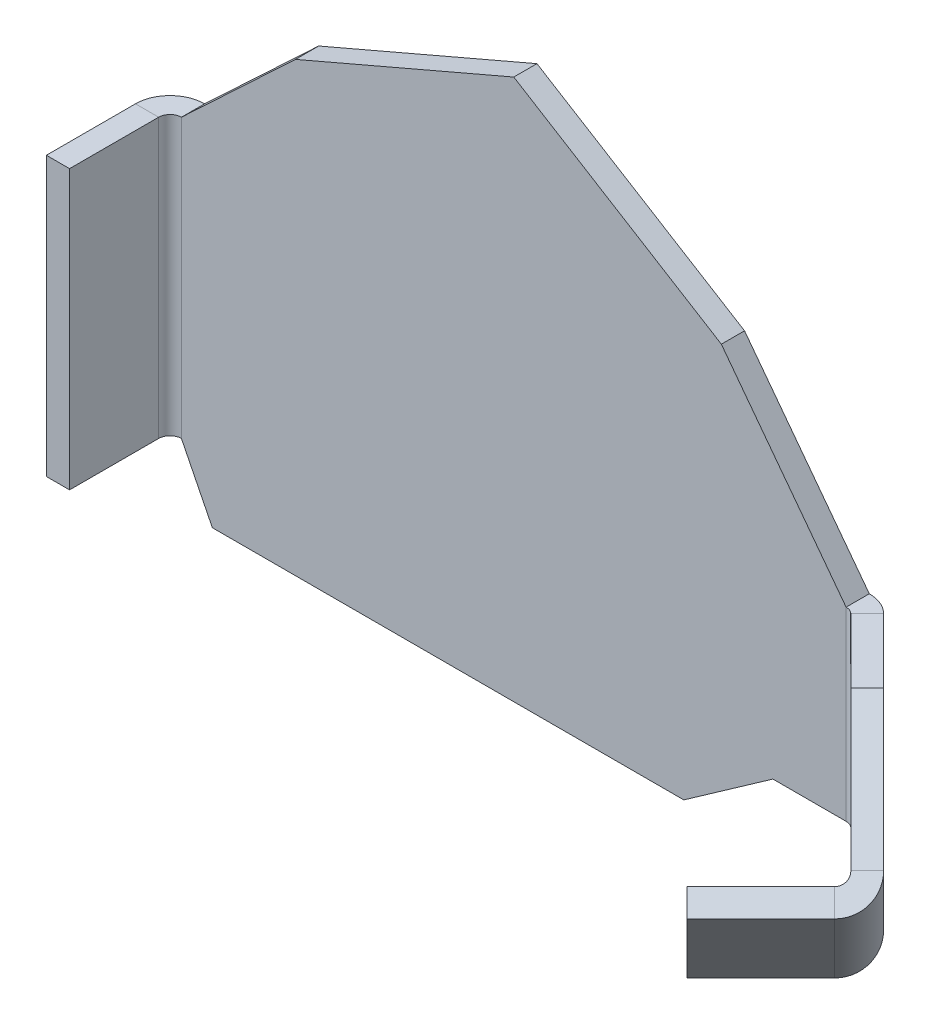
ISO-10303-21;
HEADER;
FILE_DESCRIPTION(('STEP AP214'),'2;1');
FILE_NAME('part.step','',(''),(''),'','','');
FILE_SCHEMA(('AUTOMOTIVE_DESIGN { 1 0 10303 214 1 1 1 1 }'));
ENDSEC;
DATA;
#1=APPLICATION_CONTEXT('core data for automotive mechanical design processes');
#2=APPLICATION_PROTOCOL_DEFINITION('international standard','automotive_design',2000,#1);
#3=PRODUCT_CONTEXT('',#1,'mechanical');
#4=PRODUCT('Part','Part','',(#3));
#5=PRODUCT_RELATED_PRODUCT_CATEGORY('part','',(#4));
#6=PRODUCT_DEFINITION_FORMATION('','',#4);
#7=PRODUCT_DEFINITION_CONTEXT('part definition',#1,'design');
#8=PRODUCT_DEFINITION('design','',#6,#7);
#9=PRODUCT_DEFINITION_SHAPE('','',#8);
#10=(LENGTH_UNIT() NAMED_UNIT(*) SI_UNIT(.MILLI.,.METRE.));
#11=(NAMED_UNIT(*) PLANE_ANGLE_UNIT() SI_UNIT($,.RADIAN.));
#12=(NAMED_UNIT(*) SI_UNIT($,.STERADIAN.) SOLID_ANGLE_UNIT());
#13=UNCERTAINTY_MEASURE_WITH_UNIT(LENGTH_MEASURE(1.E-05),#10,'distance_accuracy_value','');
#14=(GEOMETRIC_REPRESENTATION_CONTEXT(3) GLOBAL_UNCERTAINTY_ASSIGNED_CONTEXT((#13)) GLOBAL_UNIT_ASSIGNED_CONTEXT((#10,
#11,#12)) REPRESENTATION_CONTEXT('',''));
#15=CARTESIAN_POINT('',(0.,0.,0.));
#16=DIRECTION('',(0.,0.,1.));
#17=DIRECTION('',(1.,0.,0.));
#18=AXIS2_PLACEMENT_3D('',#15,#16,#17);
#19=CARTESIAN_POINT('',(12.1157698818237,0.,-11.8106601717798));
#20=DIRECTION('',(-0.707106781186544,0.,0.707106781186551));
#21=DIRECTION('',(0.707106781186551,0.,0.707106781186544));
#22=AXIS2_PLACEMENT_3D('',#19,#20,#21);
#23=PLANE('',#22);
#24=DIRECTION('',(0.500000000000003,-0.707106781186547,0.499999999999997));
#25=VECTOR('',#24,1.);
#26=CARTESIAN_POINT('',(23.6904280666929,16.3690385848747,-0.236001986910732));
#27=LINE('',#26,#25);
#28=CARTESIAN_POINT('',(32.5403910842826,3.85330085889911,8.61396103067887));
#29=VERTEX_POINT('',#28);
#30=CARTESIAN_POINT('',(36.7830317714019,-2.14669914110089,12.8566017177981));
#31=VERTEX_POINT('',#30);
#32=EDGE_CURVE('E117',#29,#31,#27,.T.);
#33=ORIENTED_EDGE('',*,*,#32,.T.);
#34=DIRECTION('',(-0.500000000000005,-0.707106781186544,-0.5));
#35=VECTOR('',#34,1.);
#36=CARTESIAN_POINT('',(25.2083735865326,-18.5157377259756,1.28194353292891));
#37=LINE('',#36,#35);
#38=CARTESIAN_POINT('',(28.7903910842825,-13.45,4.86396103067881));
#39=VERTEX_POINT('',#38);
#40=EDGE_CURVE('E337',#31,#39,#37,.T.);
#41=ORIENTED_EDGE('',*,*,#40,.T.);
#42=DIRECTION('',(-0.707106781186551,0.,-0.707106781186544));
#43=VECTOR('',#42,1.);
#44=CARTESIAN_POINT('',(12.1157698818237,-13.45,-11.8106601717798));
#45=LINE('',#44,#43);
#46=CARTESIAN_POINT('',(23.0815150268018,-13.45,-0.844915026801843));
#47=VERTEX_POINT('',#46);
#48=EDGE_CURVE('E345',#39,#47,#45,.T.);
#49=ORIENTED_EDGE('',*,*,#48,.T.);
#50=DIRECTION('',(0.,1.,0.));
#51=VECTOR('',#50,1.);
#52=CARTESIAN_POINT('',(23.0815150268018,-13.45,-0.844915026801843));
#53=LINE('',#52,#51);
#54=CARTESIAN_POINT('',(23.0815150268018,-1.45,-0.844915026801844));
#55=VERTEX_POINT('',#54);
#56=EDGE_CURVE('E356',#55,#47,#53,.F.);
#57=ORIENTED_EDGE('',*,*,#56,.F.);
#58=DIRECTION('',(0.707106781186551,0.,0.707106781186544));
#59=VECTOR('',#58,1.);
#60=CARTESIAN_POINT('',(12.1157698818237,-1.45,-11.8106601717798));
#61=LINE('',#60,#59);
#62=CARTESIAN_POINT('',(28.7903910842826,-1.45,4.8639610306789));
#63=VERTEX_POINT('',#62);
#64=EDGE_CURVE('E348',#55,#63,#61,.T.);
#65=ORIENTED_EDGE('',*,*,#64,.T.);
#66=DIRECTION('',(0.500000000000002,0.707106781186549,0.499999999999996));
#67=VECTOR('',#66,1.);
#68=CARTESIAN_POINT('',(28.7903910842826,-1.45,4.8639610306789));
#69=LINE('',#68,#67);
#70=EDGE_CURVE('E326',#63,#29,#69,.T.);
#71=ORIENTED_EDGE('',*,*,#70,.T.);
#72=EDGE_LOOP('',(#33,#41,#49,#57,#65,#71));
#73=FACE_BOUND('',#72,.T.);
#74=ADVANCED_FACE('F100',(#73),#23,.F.);
#75=CARTESIAN_POINT('',(11.0551097100439,0.,-10.75));
#76=DIRECTION('',(-0.707106781186544,0.,0.707106781186551));
#77=DIRECTION('',(0.707106781186551,0.,0.707106781186544));
#78=AXIS2_PLACEMENT_3D('',#75,#76,#77);
#79=PLANE('',#78);
#80=DIRECTION('',(-0.500000000000005,-0.707106781186544,-0.5));
#81=VECTOR('',#80,1.);
#82=CARTESIAN_POINT('',(24.1477134147528,-18.5157377259756,2.34260370470874));
#83=LINE('',#82,#81);
#84=CARTESIAN_POINT('',(35.7223715996221,-2.1466991411009,13.917261889578));
#85=VERTEX_POINT('',#84);
#86=CARTESIAN_POINT('',(27.7297309125027,-13.45,5.92462120245863));
#87=VERTEX_POINT('',#86);
#88=EDGE_CURVE('E334',#85,#87,#83,.T.);
#89=ORIENTED_EDGE('',*,*,#88,.F.);
#90=DIRECTION('',(0.500000000000003,-0.707106781186547,0.499999999999997));
#91=VECTOR('',#90,1.);
#92=CARTESIAN_POINT('',(22.6297678949131,16.3690385848747,0.824658184869095));
#93=LINE('',#92,#91);
#94=CARTESIAN_POINT('',(31.4797309125028,3.85330085889911,9.67462120245869));
#95=VERTEX_POINT('',#94);
#96=EDGE_CURVE('E319',#95,#85,#93,.T.);
#97=ORIENTED_EDGE('',*,*,#96,.F.);
#98=DIRECTION('',(0.500000000000002,0.707106781186549,0.499999999999997));
#99=VECTOR('',#98,1.);
#100=CARTESIAN_POINT('',(27.7297309125028,-1.45,5.92462120245872));
#101=LINE('',#100,#99);
#102=CARTESIAN_POINT('',(27.7297309125028,-1.45,5.92462120245873));
#103=VERTEX_POINT('',#102);
#104=EDGE_CURVE('E331',#103,#95,#101,.T.);
#105=ORIENTED_EDGE('',*,*,#104,.F.);
#106=DIRECTION('',(-0.707106781186551,0.,-0.707106781186544));
#107=VECTOR('',#106,1.);
#108=CARTESIAN_POINT('',(36.2150122867414,-1.45,14.4099025766972));
#109=LINE('',#108,#107);
#110=CARTESIAN_POINT('',(22.020854855022,-1.45,0.215745144977982));
#111=VERTEX_POINT('',#110);
#112=EDGE_CURVE('E353',#111,#103,#109,.F.);
#113=ORIENTED_EDGE('',*,*,#112,.F.);
#114=DIRECTION('',(0.,1.,0.));
#115=VECTOR('',#114,1.);
#116=CARTESIAN_POINT('',(22.020854855022,-13.45,0.215745144977983));
#117=LINE('',#116,#115);
#118=CARTESIAN_POINT('',(22.020854855022,-13.45,0.215745144977981));
#119=VERTEX_POINT('',#118);
#120=EDGE_CURVE('E362',#119,#111,#117,.T.);
#121=ORIENTED_EDGE('',*,*,#120,.F.);
#122=DIRECTION('',(0.707106781186551,0.,0.707106781186544));
#123=VECTOR('',#122,1.);
#124=CARTESIAN_POINT('',(21.805109710044,-13.45,0.));
#125=LINE('',#124,#123);
#126=EDGE_CURVE('E351',#87,#119,#125,.F.);
#127=ORIENTED_EDGE('',*,*,#126,.F.);
#128=EDGE_LOOP('',(#89,#97,#105,#113,#121,#127));
#129=FACE_BOUND('',#128,.T.);
#130=ADVANCED_FACE('F534',(#129),#79,.T.);
#131=CARTESIAN_POINT('',(17.8969405565523,-1.45,15.7574115584093));
#132=DIRECTION('',(-0.500000000000004,0.707106781186546,-0.499999999999998));
#133=DIRECTION('',(-0.816496580927724,-0.577350269189629,0.));
#134=AXIS2_PLACEMENT_3D('',#131,#132,#133);
#135=PLANE('',#134);
#136=ORIENTED_EDGE('',*,*,#104,.T.);
#137=DIRECTION('',(0.707106781186544,0.,-0.707106781186551));
#138=VECTOR('',#137,1.);
#139=CARTESIAN_POINT('',(32.5403910842826,3.85330085889911,8.61396103067887));
#140=LINE('',#139,#138);
#141=EDGE_CURVE('E322',#29,#95,#140,.F.);
#142=ORIENTED_EDGE('',*,*,#141,.F.);
#143=ORIENTED_EDGE('',*,*,#70,.F.);
#144=DIRECTION('',(0.707106781186544,0.,-0.707106781186551));
#145=VECTOR('',#144,1.);
#146=CARTESIAN_POINT('',(17.8969405565523,-1.45,15.7574115584093));
#147=LINE('',#146,#145);
#148=EDGE_CURVE('E330',#103,#63,#147,.T.);
#149=ORIENTED_EDGE('',*,*,#148,.F.);
#150=EDGE_LOOP('',(#136,#142,#143,#149));
#151=FACE_BOUND('',#150,.T.);
#152=ADVANCED_FACE('F521',(#151),#135,.T.);
#153=CARTESIAN_POINT('',(22.8657698818238,-13.45,-1.06066017177983));
#154=DIRECTION('',(0.,1.,0.));
#155=DIRECTION('',(0.,0.,1.));
#156=AXIS2_PLACEMENT_3D('',#153,#154,#155);
#157=PLANE('',#156);
#158=DIRECTION('',(-0.707106781186544,0.,0.707106781186551));
#159=VECTOR('',#158,1.);
#160=CARTESIAN_POINT('',(27.7297309125027,-13.45,5.92462120245864));
#161=LINE('',#160,#159);
#162=EDGE_CURVE('E340',#87,#39,#161,.F.);
#163=ORIENTED_EDGE('',*,*,#162,.F.);
#164=ORIENTED_EDGE('',*,*,#126,.T.);
#165=DIRECTION('',(-0.707106781186544,0.,0.707106781186551));
#166=VECTOR('',#165,1.);
#167=CARTESIAN_POINT('',(23.0815150268018,-13.45,-0.844915026801845));
#168=LINE('',#167,#166);
#169=EDGE_CURVE('E344',#119,#47,#168,.F.);
#170=ORIENTED_EDGE('',*,*,#169,.T.);
#171=ORIENTED_EDGE('',*,*,#48,.F.);
#172=EDGE_LOOP('',(#163,#164,#170,#171));
#173=FACE_BOUND('',#172,.T.);
#174=ADVANCED_FACE('F525',(#173),#157,.F.);
#175=CARTESIAN_POINT('',(0.,0.,-1.5));
#176=DIRECTION('',(0.,0.,-1.));
#177=DIRECTION('',(-1.,0.,0.));
#178=AXIS2_PLACEMENT_3D('',#175,#176,#177);
#179=PLANE('',#178);
#180=DIRECTION('',(-1.,0.,0.));
#181=VECTOR('',#180,1.);
#182=CARTESIAN_POINT('',(0.,-13.45,-1.5));
#183=LINE('',#182,#181);
#184=CARTESIAN_POINT('',(21.5,-13.45,-1.5));
#185=VERTEX_POINT('',#184);
#186=CARTESIAN_POINT('',(16.7648882818364,-13.45,-1.5));
#187=VERTEX_POINT('',#186);
#188=EDGE_CURVE('E125',#185,#187,#183,.T.);
#189=ORIENTED_EDGE('',*,*,#188,.T.);
#190=DIRECTION('',(-0.818258633355709,-0.574850249142198,0.));
#191=VECTOR('',#190,1.);
#192=CARTESIAN_POINT('',(11.8665640351548,-16.8912138152903,-1.5));
#193=LINE('',#192,#191);
#194=CARTESIAN_POINT('',(11.,-17.5,-1.5));
#195=VERTEX_POINT('',#194);
#196=EDGE_CURVE('E428',#187,#195,#193,.T.);
#197=ORIENTED_EDGE('',*,*,#196,.T.);
#198=DIRECTION('',(1.,0.,0.));
#199=VECTOR('',#198,1.);
#200=CARTESIAN_POINT('',(-21.5,-17.5,-1.5));
#201=LINE('',#200,#199);
#202=CARTESIAN_POINT('',(-19.5,-17.5,-1.5));
#203=VERTEX_POINT('',#202);
#204=EDGE_CURVE('E13',#203,#195,#201,.T.);
#205=ORIENTED_EDGE('',*,*,#204,.F.);
#206=DIRECTION('',(-0.447213595499956,0.894427190999917,0.));
#207=VECTOR('',#206,1.);
#208=CARTESIAN_POINT('',(-22.6,-11.3,-1.5));
#209=LINE('',#208,#207);
#210=CARTESIAN_POINT('',(-21.5,-13.5,-1.50000000000001));
#211=VERTEX_POINT('',#210);
#212=EDGE_CURVE('E439',#203,#211,#209,.T.);
#213=ORIENTED_EDGE('',*,*,#212,.T.);
#214=DIRECTION('',(0.,-1.,0.));
#215=VECTOR('',#214,1.);
#216=CARTESIAN_POINT('',(-21.5,-17.5,-1.5));
#217=LINE('',#216,#215);
#218=CARTESIAN_POINT('',(-21.5,4.5,-1.5));
#219=VERTEX_POINT('',#218);
#220=EDGE_CURVE('E109',#219,#211,#217,.T.);
#221=ORIENTED_EDGE('',*,*,#220,.F.);
#222=DIRECTION('',(0.729010021863107,0.684503022654504,0.));
#223=VECTOR('',#222,1.);
#224=CARTESIAN_POINT('',(-12.319247378296,13.1202558693764,-1.5));
#225=LINE('',#224,#223);
#226=CARTESIAN_POINT('',(-14.1214855490323,11.4280466563129,-1.5));
#227=VERTEX_POINT('',#226);
#228=EDGE_CURVE('E449',#219,#227,#225,.T.);
#229=ORIENTED_EDGE('',*,*,#228,.T.);
#230=DIRECTION('',(0.918675926318023,0.395012078807373,0.));
#231=VECTOR('',#230,1.);
#232=CARTESIAN_POINT('',(-6.3505415295905,14.7693955079349,-1.5));
#233=LINE('',#232,#231);
#234=CARTESIAN_POINT('',(0.,17.5,-1.5));
#235=VERTEX_POINT('',#234);
#236=EDGE_CURVE('E451',#227,#235,#233,.T.);
#237=ORIENTED_EDGE('',*,*,#236,.T.);
#238=DIRECTION('',(0.851994636524615,-0.523550512685538,0.));
#239=VECTOR('',#238,1.);
#240=CARTESIAN_POINT('',(7.80608900326133,12.7031600616674,-1.5));
#241=LINE('',#240,#239);
#242=CARTESIAN_POINT('',(13.4297318459576,9.2474327985664,-1.5));
#243=VERTEX_POINT('',#242);
#244=EDGE_CURVE('E464',#235,#243,#241,.T.);
#245=ORIENTED_EDGE('',*,*,#244,.T.);
#246=DIRECTION('',(0.602251612092996,-0.798306329507281,0.));
#247=VECTOR('',#246,1.);
#248=CARTESIAN_POINT('',(13.0046665610846,9.81087223244126,-1.5));
#249=LINE('',#248,#247);
#250=CARTESIAN_POINT('',(21.5,-1.45,-1.5));
#251=VERTEX_POINT('',#250);
#252=EDGE_CURVE('E458',#243,#251,#249,.T.);
#253=ORIENTED_EDGE('',*,*,#252,.T.);
#254=DIRECTION('',(0.,1.,0.));
#255=VECTOR('',#254,1.);
#256=CARTESIAN_POINT('',(21.5,-17.5,-1.5));
#257=LINE('',#256,#255);
#258=EDGE_CURVE('E479',#185,#251,#257,.T.);
#259=ORIENTED_EDGE('',*,*,#258,.F.);
#260=EDGE_LOOP('',(#189,#197,#205,#213,#221,#229,#237,#245,#253,#259));
#261=FACE_BOUND('',#260,.T.);
#262=ADVANCED_FACE('F501',(#261),#179,.T.);
#263=CARTESIAN_POINT('',(0.,0.,0.));
#264=DIRECTION('',(0.,0.,-1.));
#265=DIRECTION('',(-1.,0.,0.));
#266=AXIS2_PLACEMENT_3D('',#263,#264,#265);
#267=PLANE('',#266);
#268=DIRECTION('',(-0.818258633355709,-0.574850249142198,0.));
#269=VECTOR('',#268,1.);
#270=CARTESIAN_POINT('',(11.8665640351548,-16.8912138152903,0.));
#271=LINE('',#270,#269);
#272=CARTESIAN_POINT('',(16.7648882818364,-13.45,0.));
#273=VERTEX_POINT('',#272);
#274=CARTESIAN_POINT('',(11.,-17.5,0.));
#275=VERTEX_POINT('',#274);
#276=EDGE_CURVE('E423',#273,#275,#271,.T.);
#277=ORIENTED_EDGE('',*,*,#276,.F.);
#278=DIRECTION('',(-1.,0.,0.));
#279=VECTOR('',#278,1.);
#280=CARTESIAN_POINT('',(0.,-13.45,0.));
#281=LINE('',#280,#279);
#282=CARTESIAN_POINT('',(21.5,-13.45,0.));
#283=VERTEX_POINT('',#282);
#284=EDGE_CURVE('E432',#283,#273,#281,.T.);
#285=ORIENTED_EDGE('',*,*,#284,.F.);
#286=DIRECTION('',(0.,1.,0.));
#287=VECTOR('',#286,1.);
#288=CARTESIAN_POINT('',(21.5,-17.5,0.));
#289=LINE('',#288,#287);
#290=CARTESIAN_POINT('',(21.5,-1.45,0.));
#291=VERTEX_POINT('',#290);
#292=EDGE_CURVE('E476',#283,#291,#289,.T.);
#293=ORIENTED_EDGE('',*,*,#292,.T.);
#294=DIRECTION('',(0.602251612092996,-0.798306329507281,0.));
#295=VECTOR('',#294,1.);
#296=CARTESIAN_POINT('',(13.0046665610846,9.81087223244126,0.));
#297=LINE('',#296,#295);
#298=CARTESIAN_POINT('',(13.4297318459576,9.2474327985664,0.));
#299=VERTEX_POINT('',#298);
#300=EDGE_CURVE('E460',#299,#291,#297,.T.);
#301=ORIENTED_EDGE('',*,*,#300,.F.);
#302=DIRECTION('',(0.851994636524615,-0.523550512685538,0.));
#303=VECTOR('',#302,1.);
#304=CARTESIAN_POINT('',(7.80608900326133,12.7031600616674,0.));
#305=LINE('',#304,#303);
#306=CARTESIAN_POINT('',(0.,17.5,0.));
#307=VERTEX_POINT('',#306);
#308=EDGE_CURVE('E463',#307,#299,#305,.T.);
#309=ORIENTED_EDGE('',*,*,#308,.F.);
#310=DIRECTION('',(0.918675926318023,0.395012078807373,0.));
#311=VECTOR('',#310,1.);
#312=CARTESIAN_POINT('',(-6.3505415295905,14.7693955079349,0.));
#313=LINE('',#312,#311);
#314=CARTESIAN_POINT('',(-14.1214855490323,11.4280466563129,0.));
#315=VERTEX_POINT('',#314);
#316=EDGE_CURVE('E448',#315,#307,#313,.T.);
#317=ORIENTED_EDGE('',*,*,#316,.F.);
#318=DIRECTION('',(0.729010021863107,0.684503022654504,0.));
#319=VECTOR('',#318,1.);
#320=CARTESIAN_POINT('',(-12.319247378296,13.1202558693764,0.));
#321=LINE('',#320,#319);
#322=CARTESIAN_POINT('',(-21.5,4.5,0.));
#323=VERTEX_POINT('',#322);
#324=EDGE_CURVE('E456',#323,#315,#321,.T.);
#325=ORIENTED_EDGE('',*,*,#324,.F.);
#326=DIRECTION('',(0.,-1.,0.));
#327=VECTOR('',#326,1.);
#328=CARTESIAN_POINT('',(-21.5,-17.5,0.));
#329=LINE('',#328,#327);
#330=CARTESIAN_POINT('',(-21.5,-13.5,0.));
#331=VERTEX_POINT('',#330);
#332=EDGE_CURVE('E484',#323,#331,#329,.T.);
#333=ORIENTED_EDGE('',*,*,#332,.T.);
#334=DIRECTION('',(-0.447213595499956,0.894427190999917,0.));
#335=VECTOR('',#334,1.);
#336=CARTESIAN_POINT('',(-22.6,-11.3,0.));
#337=LINE('',#336,#335);
#338=CARTESIAN_POINT('',(-19.5,-17.5,0.));
#339=VERTEX_POINT('',#338);
#340=EDGE_CURVE('E438',#339,#331,#337,.T.);
#341=ORIENTED_EDGE('',*,*,#340,.F.);
#342=DIRECTION('',(1.,0.,0.));
#343=VECTOR('',#342,1.);
#344=CARTESIAN_POINT('',(-21.5,-17.5,0.));
#345=LINE('',#344,#343);
#346=EDGE_CURVE('E104',#339,#275,#345,.T.);
#347=ORIENTED_EDGE('',*,*,#346,.T.);
#348=EDGE_LOOP('',(#277,#285,#293,#301,#309,#317,#325,#333,#341,#347));
#349=FACE_BOUND('',#348,.T.);
#350=ADVANCED_FACE('F493',(#349),#267,.F.);
#351=CARTESIAN_POINT('',(-21.5,-17.5,-1.5));
#352=DIRECTION('',(0.,-1.,0.));
#353=DIRECTION('',(0.,0.,-1.));
#354=AXIS2_PLACEMENT_3D('',#351,#352,#353);
#355=PLANE('',#354);
#356=ORIENTED_EDGE('',*,*,#204,.T.);
#357=DIRECTION('',(0.,0.,-1.));
#358=VECTOR('',#357,1.);
#359=CARTESIAN_POINT('',(11.,-17.5,-1.5));
#360=LINE('',#359,#358);
#361=EDGE_CURVE('E425',#195,#275,#360,.F.);
#362=ORIENTED_EDGE('',*,*,#361,.T.);
#363=ORIENTED_EDGE('',*,*,#346,.F.);
#364=DIRECTION('',(0.,0.,-1.));
#365=VECTOR('',#364,1.);
#366=CARTESIAN_POINT('',(-19.5,-17.5,-1.5));
#367=LINE('',#366,#365);
#368=EDGE_CURVE('E436',#203,#339,#367,.F.);
#369=ORIENTED_EDGE('',*,*,#368,.F.);
#370=EDGE_LOOP('',(#356,#362,#363,#369));
#371=FACE_BOUND('',#370,.T.);
#372=ADVANCED_FACE('F102',(#371),#355,.T.);
#373=CARTESIAN_POINT('',(13.0046665610846,9.81087223244126,-1.5));
#374=DIRECTION('',(0.798306329507281,0.602251612092996,0.));
#375=DIRECTION('',(0.602251612092996,-0.798306329507281,0.));
#376=AXIS2_PLACEMENT_3D('',#373,#374,#375);
#377=PLANE('',#376);
#378=DIRECTION('',(0.,0.,-1.));
#379=VECTOR('',#378,1.);
#380=CARTESIAN_POINT('',(21.5,-1.45,-1.5));
#381=LINE('',#380,#379);
#382=EDGE_CURVE('E470',#251,#291,#381,.F.);
#383=ORIENTED_EDGE('',*,*,#382,.F.);
#384=ORIENTED_EDGE('',*,*,#252,.F.);
#385=DIRECTION('',(0.,0.,-1.));
#386=VECTOR('',#385,1.);
#387=CARTESIAN_POINT('',(13.4297318459576,9.2474327985664,-1.5));
#388=LINE('',#387,#386);
#389=EDGE_CURVE('E466',#243,#299,#388,.F.);
#390=ORIENTED_EDGE('',*,*,#389,.T.);
#391=ORIENTED_EDGE('',*,*,#300,.T.);
#392=EDGE_LOOP('',(#383,#384,#390,#391));
#393=FACE_BOUND('',#392,.T.);
#394=ADVANCED_FACE('F638',(#393),#377,.T.);
#395=CARTESIAN_POINT('',(7.80608900326133,12.7031600616674,-1.5));
#396=DIRECTION('',(0.523550512685538,0.851994636524615,0.));
#397=DIRECTION('',(0.851994636524615,-0.523550512685538,0.));
#398=AXIS2_PLACEMENT_3D('',#395,#396,#397);
#399=PLANE('',#398);
#400=ORIENTED_EDGE('',*,*,#244,.F.);
#401=DIRECTION('',(0.,0.,-1.));
#402=VECTOR('',#401,1.);
#403=CARTESIAN_POINT('',(0.,17.5,-1.5));
#404=LINE('',#403,#402);
#405=EDGE_CURVE('E473',#235,#307,#404,.F.);
#406=ORIENTED_EDGE('',*,*,#405,.T.);
#407=ORIENTED_EDGE('',*,*,#308,.T.);
#408=ORIENTED_EDGE('',*,*,#389,.F.);
#409=EDGE_LOOP('',(#400,#406,#407,#408));
#410=FACE_BOUND('',#409,.T.);
#411=ADVANCED_FACE('F636',(#410),#399,.T.);
#412=CARTESIAN_POINT('',(-6.3505415295905,14.7693955079349,-1.5));
#413=DIRECTION('',(-0.395012078807373,0.918675926318023,0.));
#414=DIRECTION('',(0.918675926318023,0.395012078807373,0.));
#415=AXIS2_PLACEMENT_3D('',#412,#413,#414);
#416=PLANE('',#415);
#417=ORIENTED_EDGE('',*,*,#405,.F.);
#418=ORIENTED_EDGE('',*,*,#236,.F.);
#419=DIRECTION('',(0.,0.,-1.));
#420=VECTOR('',#419,1.);
#421=CARTESIAN_POINT('',(-14.1214855490323,11.4280466563129,-1.5));
#422=LINE('',#421,#420);
#423=EDGE_CURVE('E445',#227,#315,#422,.F.);
#424=ORIENTED_EDGE('',*,*,#423,.T.);
#425=ORIENTED_EDGE('',*,*,#316,.T.);
#426=EDGE_LOOP('',(#417,#418,#424,#425));
#427=FACE_BOUND('',#426,.T.);
#428=ADVANCED_FACE('F632',(#427),#416,.T.);
#429=CARTESIAN_POINT('',(-12.319247378296,13.1202558693764,-1.5));
#430=DIRECTION('',(-0.684503022654504,0.729010021863107,0.));
#431=DIRECTION('',(0.729010021863107,0.684503022654504,0.));
#432=AXIS2_PLACEMENT_3D('',#429,#430,#431);
#433=PLANE('',#432);
#434=ORIENTED_EDGE('',*,*,#228,.F.);
#435=DIRECTION('',(0.,0.,-1.));
#436=VECTOR('',#435,1.);
#437=CARTESIAN_POINT('',(-21.5,4.5,-1.5));
#438=LINE('',#437,#436);
#439=EDGE_CURVE('E444',#219,#323,#438,.F.);
#440=ORIENTED_EDGE('',*,*,#439,.T.);
#441=ORIENTED_EDGE('',*,*,#324,.T.);
#442=ORIENTED_EDGE('',*,*,#423,.F.);
#443=EDGE_LOOP('',(#434,#440,#441,#442));
#444=FACE_BOUND('',#443,.T.);
#445=ADVANCED_FACE('F628',(#444),#433,.T.);
#446=CARTESIAN_POINT('',(-22.6,-11.3,-1.5));
#447=DIRECTION('',(-0.894427190999917,-0.447213595499956,0.));
#448=DIRECTION('',(-0.447213595499956,0.894427190999917,0.));
#449=AXIS2_PLACEMENT_3D('',#446,#447,#448);
#450=PLANE('',#449);
#451=DIRECTION('',(0.,0.,-1.));
#452=VECTOR('',#451,1.);
#453=CARTESIAN_POINT('',(-21.5,-13.5,-1.5));
#454=LINE('',#453,#452);
#455=EDGE_CURVE('E434',#211,#331,#454,.F.);
#456=ORIENTED_EDGE('',*,*,#455,.F.);
#457=ORIENTED_EDGE('',*,*,#212,.F.);
#458=ORIENTED_EDGE('',*,*,#368,.T.);
#459=ORIENTED_EDGE('',*,*,#340,.T.);
#460=EDGE_LOOP('',(#456,#457,#458,#459));
#461=FACE_BOUND('',#460,.T.);
#462=ADVANCED_FACE('F625',(#461),#450,.T.);
#463=CARTESIAN_POINT('',(11.8665640351548,-16.8912138152903,-1.5));
#464=DIRECTION('',(0.574850249142198,-0.818258633355709,0.));
#465=DIRECTION('',(-0.818258633355709,-0.574850249142198,0.));
#466=AXIS2_PLACEMENT_3D('',#463,#464,#465);
#467=PLANE('',#466);
#468=ORIENTED_EDGE('',*,*,#361,.F.);
#469=ORIENTED_EDGE('',*,*,#196,.F.);
#470=DIRECTION('',(0.,0.,-1.));
#471=VECTOR('',#470,1.);
#472=CARTESIAN_POINT('',(16.7648882818364,-13.45,-1.5));
#473=LINE('',#472,#471);
#474=EDGE_CURVE('E420',#187,#273,#473,.F.);
#475=ORIENTED_EDGE('',*,*,#474,.T.);
#476=ORIENTED_EDGE('',*,*,#276,.T.);
#477=EDGE_LOOP('',(#468,#469,#475,#476));
#478=FACE_BOUND('',#477,.T.);
#479=ADVANCED_FACE('F499',(#478),#467,.T.);
#480=CARTESIAN_POINT('',(0.,-13.45,-1.5));
#481=DIRECTION('',(0.,-1.,0.));
#482=DIRECTION('',(-1.,0.,0.));
#483=AXIS2_PLACEMENT_3D('',#480,#481,#482);
#484=PLANE('',#483);
#485=ORIENTED_EDGE('',*,*,#188,.F.);
#486=DIRECTION('',(0.,0.,-1.));
#487=VECTOR('',#486,1.);
#488=CARTESIAN_POINT('',(21.5,-13.45,-1.5));
#489=LINE('',#488,#487);
#490=EDGE_CURVE('E411',#185,#283,#489,.F.);
#491=ORIENTED_EDGE('',*,*,#490,.T.);
#492=ORIENTED_EDGE('',*,*,#284,.T.);
#493=ORIENTED_EDGE('',*,*,#474,.F.);
#494=EDGE_LOOP('',(#485,#491,#492,#493));
#495=FACE_BOUND('',#494,.T.);
#496=ADVANCED_FACE('F616',(#495),#484,.T.);
#497=CARTESIAN_POINT('',(-21.5,4.5,0.736599999999999));
#498=DIRECTION('',(0.,1.,0.));
#499=DIRECTION('',(0.,0.,1.));
#500=AXIS2_PLACEMENT_3D('',#497,#498,#499);
#501=PLANE('',#500);
#502=DIRECTION('',(1.,0.,0.));
#503=VECTOR('',#502,1.);
#504=CARTESIAN_POINT('',(-23.7366,4.5,0.736599999999992));
#505=LINE('',#504,#503);
#506=CARTESIAN_POINT('',(-22.2366,4.5,0.736599999999997));
#507=VERTEX_POINT('',#506);
#508=CARTESIAN_POINT('',(-23.7366,4.5,0.736599999999992));
#509=VERTEX_POINT('',#508);
#510=EDGE_CURVE('E369',#507,#509,#505,.F.);
#511=ORIENTED_EDGE('',*,*,#510,.F.);
#512=CARTESIAN_POINT('',(-21.5,4.5,0.736599999999999));
#513=DIRECTION('',(0.,-1.,0.));
#514=DIRECTION('',(0.,0.,-1.));
#515=AXIS2_PLACEMENT_3D('',#512,#513,#514);
#516=CIRCLE('',#515,0.736600000000004);
#517=EDGE_CURVE('E415',#323,#507,#516,.F.);
#518=ORIENTED_EDGE('',*,*,#517,.F.);
#519=ORIENTED_EDGE('',*,*,#439,.F.);
#520=CARTESIAN_POINT('',(-21.5,4.5,0.736599999999999));
#521=DIRECTION('',(0.,-1.,0.));
#522=DIRECTION('',(0.,0.,-1.));
#523=AXIS2_PLACEMENT_3D('',#520,#521,#522);
#524=CIRCLE('',#523,2.2366);
#525=EDGE_CURVE('E408',#219,#509,#524,.F.);
#526=ORIENTED_EDGE('',*,*,#525,.T.);
#527=EDGE_LOOP('',(#511,#518,#519,#526));
#528=FACE_BOUND('',#527,.T.);
#529=ADVANCED_FACE('F613',(#528),#501,.T.);
#530=CARTESIAN_POINT('',(-21.5,-13.5,0.736599999999993));
#531=DIRECTION('',(0.,1.,0.));
#532=DIRECTION('',(0.,0.,1.));
#533=AXIS2_PLACEMENT_3D('',#530,#531,#532);
#534=PLANE('',#533);
#535=CARTESIAN_POINT('',(-21.5,-13.5,0.736599999999993));
#536=DIRECTION('',(0.,-1.,0.));
#537=DIRECTION('',(0.,0.,-1.));
#538=AXIS2_PLACEMENT_3D('',#535,#536,#537);
#539=CIRCLE('',#538,0.736600000000004);
#540=CARTESIAN_POINT('',(-22.2366,-13.5,0.73659999999999));
#541=VERTEX_POINT('',#540);
#542=EDGE_CURVE('E381',#541,#331,#539,.T.);
#543=ORIENTED_EDGE('',*,*,#542,.F.);
#544=DIRECTION('',(1.,0.,0.));
#545=VECTOR('',#544,1.);
#546=CARTESIAN_POINT('',(-22.2366,-13.5,0.73659999999999));
#547=LINE('',#546,#545);
#548=CARTESIAN_POINT('',(-23.7366,-13.5,0.736599999999985));
#549=VERTEX_POINT('',#548);
#550=EDGE_CURVE('E401',#541,#549,#547,.F.);
#551=ORIENTED_EDGE('',*,*,#550,.T.);
#552=CARTESIAN_POINT('',(-21.5,-13.5,0.736599999999993));
#553=DIRECTION('',(0.,-1.,0.));
#554=DIRECTION('',(0.,0.,-1.));
#555=AXIS2_PLACEMENT_3D('',#552,#553,#554);
#556=CIRCLE('',#555,2.2366);
#557=EDGE_CURVE('E412',#549,#211,#556,.T.);
#558=ORIENTED_EDGE('',*,*,#557,.T.);
#559=ORIENTED_EDGE('',*,*,#455,.T.);
#560=EDGE_LOOP('',(#543,#551,#558,#559));
#561=FACE_BOUND('',#560,.T.);
#562=ADVANCED_FACE('F608',(#561),#534,.F.);
#563=CARTESIAN_POINT('',(-21.5,-13.5,0.736599999999993));
#564=DIRECTION('',(0.,-1.,0.));
#565=DIRECTION('',(-1.,0.,0.));
#566=AXIS2_PLACEMENT_3D('',#563,#564,#565);
#567=CYLINDRICAL_SURFACE('',#566,2.2366);
#568=ORIENTED_EDGE('',*,*,#220,.T.);
#569=ORIENTED_EDGE('',*,*,#557,.F.);
#570=DIRECTION('',(0.,-1.,0.));
#571=VECTOR('',#570,1.);
#572=CARTESIAN_POINT('',(-23.7366,4.5,0.736599999999992));
#573=LINE('',#572,#571);
#574=EDGE_CURVE('E399',#549,#509,#573,.F.);
#575=ORIENTED_EDGE('',*,*,#574,.T.);
#576=ORIENTED_EDGE('',*,*,#525,.F.);
#577=EDGE_LOOP('',(#568,#569,#575,#576));
#578=FACE_BOUND('',#577,.T.);
#579=ADVANCED_FACE('F605',(#578),#567,.T.);
#580=CARTESIAN_POINT('',(-21.5,-13.5,0.736599999999993));
#581=DIRECTION('',(0.,-1.,0.));
#582=DIRECTION('',(-1.,0.,0.));
#583=AXIS2_PLACEMENT_3D('',#580,#581,#582);
#584=CYLINDRICAL_SURFACE('',#583,0.736600000000004);
#585=ORIENTED_EDGE('',*,*,#332,.F.);
#586=ORIENTED_EDGE('',*,*,#517,.T.);
#587=DIRECTION('',(0.,-1.,0.));
#588=VECTOR('',#587,1.);
#589=CARTESIAN_POINT('',(-22.2366,4.5,0.736599999999997));
#590=LINE('',#589,#588);
#591=EDGE_CURVE('E404',#507,#541,#590,.T.);
#592=ORIENTED_EDGE('',*,*,#591,.T.);
#593=ORIENTED_EDGE('',*,*,#542,.T.);
#594=EDGE_LOOP('',(#585,#586,#592,#593));
#595=FACE_BOUND('',#594,.T.);
#596=ADVANCED_FACE('F603',(#595),#584,.F.);
#597=CARTESIAN_POINT('',(-23.7366,-13.5,6.5));
#598=DIRECTION('',(0.,1.,0.));
#599=DIRECTION('',(-1.,0.,0.));
#600=AXIS2_PLACEMENT_3D('',#597,#598,#599);
#601=PLANE('',#600);
#602=ORIENTED_EDGE('',*,*,#550,.F.);
#603=DIRECTION('',(0.,0.,-1.));
#604=VECTOR('',#603,1.);
#605=CARTESIAN_POINT('',(-22.2366,-13.5,6.50000000000001));
#606=LINE('',#605,#604);
#607=CARTESIAN_POINT('',(-22.2366,-13.5,6.50000000000001));
#608=VERTEX_POINT('',#607);
#609=EDGE_CURVE('E397',#541,#608,#606,.F.);
#610=ORIENTED_EDGE('',*,*,#609,.T.);
#611=DIRECTION('',(1.,0.,0.));
#612=VECTOR('',#611,1.);
#613=CARTESIAN_POINT('',(-23.7366,-13.5,6.5));
#614=LINE('',#613,#612);
#615=CARTESIAN_POINT('',(-23.7366,-13.5,6.5));
#616=VERTEX_POINT('',#615);
#617=EDGE_CURVE('E378',#616,#608,#614,.T.);
#618=ORIENTED_EDGE('',*,*,#617,.F.);
#619=DIRECTION('',(0.,0.,1.));
#620=VECTOR('',#619,1.);
#621=CARTESIAN_POINT('',(-23.7366,-13.5,0.));
#622=LINE('',#621,#620);
#623=EDGE_CURVE('E390',#549,#616,#622,.T.);
#624=ORIENTED_EDGE('',*,*,#623,.F.);
#625=EDGE_LOOP('',(#602,#610,#618,#624));
#626=FACE_BOUND('',#625,.T.);
#627=ADVANCED_FACE('F596',(#626),#601,.F.);
#628=CARTESIAN_POINT('',(-23.7366,4.5,0.));
#629=DIRECTION('',(0.,-1.,0.));
#630=DIRECTION('',(1.,0.,0.));
#631=AXIS2_PLACEMENT_3D('',#628,#629,#630);
#632=PLANE('',#631);
#633=ORIENTED_EDGE('',*,*,#510,.T.);
#634=DIRECTION('',(0.,0.,-1.));
#635=VECTOR('',#634,1.);
#636=CARTESIAN_POINT('',(-23.7366,4.5,0.));
#637=LINE('',#636,#635);
#638=CARTESIAN_POINT('',(-23.7366,4.5,6.5));
#639=VERTEX_POINT('',#638);
#640=EDGE_CURVE('E385',#639,#509,#637,.T.);
#641=ORIENTED_EDGE('',*,*,#640,.F.);
#642=DIRECTION('',(1.,0.,0.));
#643=VECTOR('',#642,1.);
#644=CARTESIAN_POINT('',(-23.7366,4.5,6.5));
#645=LINE('',#644,#643);
#646=CARTESIAN_POINT('',(-22.2366,4.5,6.50000000000001));
#647=VERTEX_POINT('',#646);
#648=EDGE_CURVE('E382',#639,#647,#645,.T.);
#649=ORIENTED_EDGE('',*,*,#648,.T.);
#650=DIRECTION('',(0.,0.,1.));
#651=VECTOR('',#650,1.);
#652=CARTESIAN_POINT('',(-22.2366,4.5,0.));
#653=LINE('',#652,#651);
#654=EDGE_CURVE('E392',#647,#507,#653,.F.);
#655=ORIENTED_EDGE('',*,*,#654,.T.);
#656=EDGE_LOOP('',(#633,#641,#649,#655));
#657=FACE_BOUND('',#656,.T.);
#658=ADVANCED_FACE('F589',(#657),#632,.F.);
#659=CARTESIAN_POINT('',(-23.7366,0.,0.));
#660=DIRECTION('',(1.,0.,0.));
#661=DIRECTION('',(0.,0.,-1.));
#662=AXIS2_PLACEMENT_3D('',#659,#660,#661);
#663=PLANE('',#662);
#664=ORIENTED_EDGE('',*,*,#574,.F.);
#665=ORIENTED_EDGE('',*,*,#623,.T.);
#666=DIRECTION('',(0.,1.,0.));
#667=VECTOR('',#666,1.);
#668=CARTESIAN_POINT('',(-23.7366,0.,6.5));
#669=LINE('',#668,#667);
#670=EDGE_CURVE('E388',#616,#639,#669,.T.);
#671=ORIENTED_EDGE('',*,*,#670,.T.);
#672=ORIENTED_EDGE('',*,*,#640,.T.);
#673=EDGE_LOOP('',(#664,#665,#671,#672));
#674=FACE_BOUND('',#673,.T.);
#675=ADVANCED_FACE('F585',(#674),#663,.F.);
#676=CARTESIAN_POINT('',(-22.2366,0.,0.));
#677=DIRECTION('',(1.,0.,0.));
#678=DIRECTION('',(0.,0.,-1.));
#679=AXIS2_PLACEMENT_3D('',#676,#677,#678);
#680=PLANE('',#679);
#681=ORIENTED_EDGE('',*,*,#609,.F.);
#682=ORIENTED_EDGE('',*,*,#591,.F.);
#683=ORIENTED_EDGE('',*,*,#654,.F.);
#684=DIRECTION('',(0.,-1.,0.));
#685=VECTOR('',#684,1.);
#686=CARTESIAN_POINT('',(-22.2366,4.5,6.50000000000001));
#687=LINE('',#686,#685);
#688=EDGE_CURVE('E395',#608,#647,#687,.F.);
#689=ORIENTED_EDGE('',*,*,#688,.F.);
#690=EDGE_LOOP('',(#681,#682,#683,#689));
#691=FACE_BOUND('',#690,.T.);
#692=ADVANCED_FACE('F588',(#691),#680,.T.);
#693=CARTESIAN_POINT('',(-23.7366,4.5,6.5));
#694=DIRECTION('',(0.,0.,-1.));
#695=DIRECTION('',(-1.,0.,0.));
#696=AXIS2_PLACEMENT_3D('',#693,#694,#695);
#697=PLANE('',#696);
#698=ORIENTED_EDGE('',*,*,#688,.T.);
#699=ORIENTED_EDGE('',*,*,#648,.F.);
#700=ORIENTED_EDGE('',*,*,#670,.F.);
#701=ORIENTED_EDGE('',*,*,#617,.T.);
#702=EDGE_LOOP('',(#698,#699,#700,#701));
#703=FACE_BOUND('',#702,.T.);
#704=ADVANCED_FACE('F581',(#703),#697,.F.);
#705=CARTESIAN_POINT('',(21.5,-13.45,0.73659999999999));
#706=DIRECTION('',(0.,-1.,0.));
#707=DIRECTION('',(0.,0.,-1.));
#708=AXIS2_PLACEMENT_3D('',#705,#706,#707);
#709=PLANE('',#708);
#710=ORIENTED_EDGE('',*,*,#169,.F.);
#711=CARTESIAN_POINT('',(21.5,-13.45,0.73659999999999));
#712=DIRECTION('',(0.,1.,0.));
#713=DIRECTION('',(0.,0.,1.));
#714=AXIS2_PLACEMENT_3D('',#711,#712,#713);
#715=CIRCLE('',#714,0.736599999999994);
#716=EDGE_CURVE('E373',#283,#119,#715,.F.);
#717=ORIENTED_EDGE('',*,*,#716,.F.);
#718=ORIENTED_EDGE('',*,*,#490,.F.);
#719=CARTESIAN_POINT('',(21.5,-13.45,0.73659999999999));
#720=DIRECTION('',(0.,1.,0.));
#721=DIRECTION('',(0.,0.,1.));
#722=AXIS2_PLACEMENT_3D('',#719,#720,#721);
#723=CIRCLE('',#722,2.23659999999999);
#724=EDGE_CURVE('E366',#185,#47,#723,.F.);
#725=ORIENTED_EDGE('',*,*,#724,.T.);
#726=EDGE_LOOP('',(#710,#717,#718,#725));
#727=FACE_BOUND('',#726,.T.);
#728=ADVANCED_FACE('F509',(#727),#709,.T.);
#729=CARTESIAN_POINT('',(21.5,-1.45,0.736599999999991));
#730=DIRECTION('',(0.,-1.,0.));
#731=DIRECTION('',(0.,0.,-1.));
#732=AXIS2_PLACEMENT_3D('',#729,#730,#731);
#733=PLANE('',#732);
#734=CARTESIAN_POINT('',(21.5,-1.45,0.736599999999991));
#735=DIRECTION('',(0.,1.,0.));
#736=DIRECTION('',(0.,0.,1.));
#737=AXIS2_PLACEMENT_3D('',#734,#735,#736);
#738=CIRCLE('',#737,0.736599999999994);
#739=EDGE_CURVE('E347',#111,#291,#738,.T.);
#740=ORIENTED_EDGE('',*,*,#739,.F.);
#741=DIRECTION('',(-0.707106781186544,0.,0.707106781186551));
#742=VECTOR('',#741,1.);
#743=CARTESIAN_POINT('',(22.020854855022,-1.45,0.215745144977984));
#744=LINE('',#743,#742);
#745=EDGE_CURVE('E359',#111,#55,#744,.F.);
#746=ORIENTED_EDGE('',*,*,#745,.T.);
#747=CARTESIAN_POINT('',(21.5,-1.45,0.736599999999991));
#748=DIRECTION('',(0.,1.,0.));
#749=DIRECTION('',(0.,0.,1.));
#750=AXIS2_PLACEMENT_3D('',#747,#748,#749);
#751=CIRCLE('',#750,2.23659999999999);
#752=EDGE_CURVE('E370',#55,#251,#751,.T.);
#753=ORIENTED_EDGE('',*,*,#752,.T.);
#754=ORIENTED_EDGE('',*,*,#382,.T.);
#755=EDGE_LOOP('',(#740,#746,#753,#754));
#756=FACE_BOUND('',#755,.T.);
#757=ADVANCED_FACE('F576',(#756),#733,.F.);
#758=CARTESIAN_POINT('',(21.5,-1.45,0.736599999999991));
#759=DIRECTION('',(0.,1.,0.));
#760=DIRECTION('',(0.707106781186544,0.,-0.707106781186551));
#761=AXIS2_PLACEMENT_3D('',#758,#759,#760);
#762=CYLINDRICAL_SURFACE('',#761,2.23659999999999);
#763=ORIENTED_EDGE('',*,*,#258,.T.);
#764=ORIENTED_EDGE('',*,*,#752,.F.);
#765=ORIENTED_EDGE('',*,*,#56,.T.);
#766=ORIENTED_EDGE('',*,*,#724,.F.);
#767=EDGE_LOOP('',(#763,#764,#765,#766));
#768=FACE_BOUND('',#767,.T.);
#769=ADVANCED_FACE('F510',(#768),#762,.T.);
#770=CARTESIAN_POINT('',(21.5,-1.45,0.736599999999991));
#771=DIRECTION('',(0.,1.,0.));
#772=DIRECTION('',(0.707106781186544,0.,-0.707106781186551));
#773=AXIS2_PLACEMENT_3D('',#770,#771,#772);
#774=CYLINDRICAL_SURFACE('',#773,0.736599999999994);
#775=ORIENTED_EDGE('',*,*,#292,.F.);
#776=ORIENTED_EDGE('',*,*,#716,.T.);
#777=ORIENTED_EDGE('',*,*,#120,.T.);
#778=ORIENTED_EDGE('',*,*,#739,.T.);
#779=EDGE_LOOP('',(#775,#776,#777,#778));
#780=FACE_BOUND('',#779,.T.);
#781=ADVANCED_FACE('F530',(#780),#774,.F.);
#782=CARTESIAN_POINT('',(37.2756724585212,-1.45,13.3492424049174));
#783=DIRECTION('',(0.,-1.,0.));
#784=DIRECTION('',(0.,0.,-1.));
#785=AXIS2_PLACEMENT_3D('',#782,#783,#784);
#786=PLANE('',#785);
#787=ORIENTED_EDGE('',*,*,#112,.T.);
#788=ORIENTED_EDGE('',*,*,#148,.T.);
#789=ORIENTED_EDGE('',*,*,#64,.F.);
#790=ORIENTED_EDGE('',*,*,#745,.F.);
#791=EDGE_LOOP('',(#787,#788,#789,#790));
#792=FACE_BOUND('',#791,.T.);
#793=ADVANCED_FACE('F517',(#792),#786,.F.);
#794=CARTESIAN_POINT('',(23.6904280666929,16.3690385848747,-0.236001986910732));
#795=DIRECTION('',(-0.500000000000003,-0.707106781186548,-0.499999999999997));
#796=DIRECTION('',(0.500000000000003,-0.707106781186547,0.499999999999997));
#797=AXIS2_PLACEMENT_3D('',#794,#795,#796);
#798=PLANE('',#797);
#799=DIRECTION('',(0.707106781186544,0.,-0.707106781186551));
#800=VECTOR('',#799,1.);
#801=CARTESIAN_POINT('',(36.7830317714019,-2.14669914110089,12.8566017177981));
#802=LINE('',#801,#800);
#803=EDGE_CURVE('E324',#31,#85,#802,.F.);
#804=ORIENTED_EDGE('',*,*,#803,.F.);
#805=ORIENTED_EDGE('',*,*,#32,.F.);
#806=ORIENTED_EDGE('',*,*,#141,.T.);
#807=ORIENTED_EDGE('',*,*,#96,.T.);
#808=EDGE_LOOP('',(#804,#805,#806,#807));
#809=FACE_BOUND('',#808,.T.);
#810=ADVANCED_FACE('F536',(#809),#798,.F.);
#811=CARTESIAN_POINT('',(27.2088760574807,-13.45,6.44547605748066));
#812=DIRECTION('',(-0.500000000000005,-0.707106781186544,-0.5));
#813=DIRECTION('',(0.816496580927722,-0.577350269189632,0.));
#814=AXIS2_PLACEMENT_3D('',#811,#812,#813);
#815=PLANE('',#814);
#816=DIRECTION('',(-0.500000000000003,0.707106781186551,-0.499999999999992));
#817=VECTOR('',#816,1.);
#818=CARTESIAN_POINT('',(28.3271760574807,-15.0315150268019,7.56377605748064));
#819=LINE('',#818,#817);
#820=CARTESIAN_POINT('',(27.5771760574807,-13.970854855022,6.81377605748065));
#821=VERTEX_POINT('',#820);
#822=CARTESIAN_POINT('',(28.3271760574807,-15.0315150268019,7.56377605748064));
#823=VERTEX_POINT('',#822);
#824=EDGE_CURVE('E289',#821,#823,#819,.F.);
#825=ORIENTED_EDGE('',*,*,#824,.F.);
#826=CARTESIAN_POINT('',(27.2088760574807,-13.45,6.44547605748066));
#827=DIRECTION('',(0.500000000000005,0.707106781186544,0.5));
#828=DIRECTION('',(-0.816496580927722,0.577350269189632,0.));
#829=AXIS2_PLACEMENT_3D('',#826,#827,#828);
#830=CIRCLE('',#829,0.736600000000011);
#831=EDGE_CURVE('E313',#87,#821,#830,.F.);
#832=ORIENTED_EDGE('',*,*,#831,.F.);
#833=ORIENTED_EDGE('',*,*,#162,.T.);
#834=CARTESIAN_POINT('',(27.2088760574807,-13.45,6.44547605748066));
#835=DIRECTION('',(0.500000000000005,0.707106781186544,0.5));
#836=DIRECTION('',(-0.816496580927722,0.577350269189632,0.));
#837=AXIS2_PLACEMENT_3D('',#834,#835,#836);
#838=CIRCLE('',#837,2.23660000000001);
#839=EDGE_CURVE('E307',#39,#823,#838,.F.);
#840=ORIENTED_EDGE('',*,*,#839,.T.);
#841=EDGE_LOOP('',(#825,#832,#833,#840));
#842=FACE_BOUND('',#841,.T.);
#843=ADVANCED_FACE('F552',(#842),#815,.T.);
#844=CARTESIAN_POINT('',(35.2015167446001,-2.1466991411009,14.4381167446));
#845=DIRECTION('',(-0.500000000000005,-0.707106781186544,-0.5));
#846=DIRECTION('',(0.816496580927722,-0.577350269189632,0.));
#847=AXIS2_PLACEMENT_3D('',#844,#845,#846);
#848=PLANE('',#847);
#849=CARTESIAN_POINT('',(35.2015167446001,-2.1466991411009,14.4381167446));
#850=DIRECTION('',(0.500000000000005,0.707106781186544,0.5));
#851=DIRECTION('',(-0.816496580927722,0.577350269189632,0.));
#852=AXIS2_PLACEMENT_3D('',#849,#850,#851);
#853=CIRCLE('',#852,0.736600000000011);
#854=CARTESIAN_POINT('',(35.5698167446001,-2.66755399612292,14.8064167446));
#855=VERTEX_POINT('',#854);
#856=EDGE_CURVE('E316',#855,#85,#853,.T.);
#857=ORIENTED_EDGE('',*,*,#856,.F.);
#858=DIRECTION('',(-0.500000000000003,0.707106781186551,-0.499999999999992));
#859=VECTOR('',#858,1.);
#860=CARTESIAN_POINT('',(35.5698167446001,-2.66755399612291,14.8064167446));
#861=LINE('',#860,#859);
#862=CARTESIAN_POINT('',(36.3198167446001,-3.72821416790275,15.5564167446));
#863=VERTEX_POINT('',#862);
#864=EDGE_CURVE('E301',#855,#863,#861,.F.);
#865=ORIENTED_EDGE('',*,*,#864,.T.);
#866=CARTESIAN_POINT('',(35.2015167446001,-2.1466991411009,14.4381167446));
#867=DIRECTION('',(0.500000000000005,0.707106781186544,0.5));
#868=DIRECTION('',(-0.816496580927722,0.577350269189632,0.));
#869=AXIS2_PLACEMENT_3D('',#866,#867,#868);
#870=CIRCLE('',#869,2.23660000000001);
#871=EDGE_CURVE('E310',#863,#31,#870,.T.);
#872=ORIENTED_EDGE('',*,*,#871,.T.);
#873=ORIENTED_EDGE('',*,*,#803,.T.);
#874=EDGE_LOOP('',(#857,#865,#872,#873));
#875=FACE_BOUND('',#874,.T.);
#876=ADVANCED_FACE('F539',(#875),#848,.F.);
#877=CARTESIAN_POINT('',(35.2015167446001,-2.1466991411009,14.4381167446));
#878=DIRECTION('',(0.500000000000005,0.707106781186544,0.5));
#879=DIRECTION('',(0.500000000000003,-0.707106781186551,0.499999999999992));
#880=AXIS2_PLACEMENT_3D('',#877,#878,#879);
#881=CYLINDRICAL_SURFACE('',#880,2.23660000000001);
#882=ORIENTED_EDGE('',*,*,#40,.F.);
#883=ORIENTED_EDGE('',*,*,#871,.F.);
#884=DIRECTION('',(0.500000000000005,0.707106781186544,0.5));
#885=VECTOR('',#884,1.);
#886=CARTESIAN_POINT('',(28.3271760574807,-15.0315150268019,7.56377605748064));
#887=LINE('',#886,#885);
#888=EDGE_CURVE('E299',#863,#823,#887,.F.);
#889=ORIENTED_EDGE('',*,*,#888,.T.);
#890=ORIENTED_EDGE('',*,*,#839,.F.);
#891=EDGE_LOOP('',(#882,#883,#889,#890));
#892=FACE_BOUND('',#891,.T.);
#893=ADVANCED_FACE('F550',(#892),#881,.T.);
#894=CARTESIAN_POINT('',(35.2015167446001,-2.1466991411009,14.4381167446));
#895=DIRECTION('',(0.500000000000005,0.707106781186544,0.5));
#896=DIRECTION('',(0.500000000000003,-0.707106781186551,0.499999999999992));
#897=AXIS2_PLACEMENT_3D('',#894,#895,#896);
#898=CYLINDRICAL_SURFACE('',#897,0.736600000000011);
#899=ORIENTED_EDGE('',*,*,#88,.T.);
#900=ORIENTED_EDGE('',*,*,#831,.T.);
#901=DIRECTION('',(0.500000000000005,0.707106781186544,0.5));
#902=VECTOR('',#901,1.);
#903=CARTESIAN_POINT('',(27.5771760574807,-13.970854855022,6.81377605748065));
#904=LINE('',#903,#902);
#905=EDGE_CURVE('E304',#821,#855,#904,.T.);
#906=ORIENTED_EDGE('',*,*,#905,.T.);
#907=ORIENTED_EDGE('',*,*,#856,.T.);
#908=EDGE_LOOP('',(#899,#900,#906,#907));
#909=FACE_BOUND('',#908,.T.);
#910=ADVANCED_FACE('F542',(#909),#898,.F.);
#911=CARTESIAN_POINT('',(31.5373707407231,-3.72821416790276,20.3388627484771));
#912=DIRECTION('',(-0.500000000000006,-0.707106781186544,-0.499999999999999));
#913=DIRECTION('',(0.816496580927722,-0.577350269189632,0.));
#914=AXIS2_PLACEMENT_3D('',#911,#912,#913);
#915=PLANE('',#914);
#916=ORIENTED_EDGE('',*,*,#864,.F.);
#917=DIRECTION('',(0.707106781186542,0.,-0.707106781186554));
#918=VECTOR('',#917,1.);
#919=CARTESIAN_POINT('',(30.7873707407231,-2.66755399612293,19.5888627484771));
#920=LINE('',#919,#918);
#921=CARTESIAN_POINT('',(30.7873707407231,-2.66755399612293,19.5888627484771));
#922=VERTEX_POINT('',#921);
#923=EDGE_CURVE('E297',#855,#922,#920,.F.);
#924=ORIENTED_EDGE('',*,*,#923,.T.);
#925=DIRECTION('',(-0.500000000000003,0.707106781186551,-0.499999999999992));
#926=VECTOR('',#925,1.);
#927=CARTESIAN_POINT('',(31.5373707407231,-3.72821416790275,20.3388627484771));
#928=LINE('',#927,#926);
#929=CARTESIAN_POINT('',(31.5373707407231,-3.72821416790276,20.3388627484771));
#930=VERTEX_POINT('',#929);
#931=EDGE_CURVE('E285',#930,#922,#928,.T.);
#932=ORIENTED_EDGE('',*,*,#931,.F.);
#933=DIRECTION('',(-0.707106781186542,0.,0.707106781186554));
#934=VECTOR('',#933,1.);
#935=CARTESIAN_POINT('',(25.9381167446004,-3.72821416790278,25.9381167445999));
#936=LINE('',#935,#934);
#937=EDGE_CURVE('E272',#863,#930,#936,.T.);
#938=ORIENTED_EDGE('',*,*,#937,.F.);
#939=EDGE_LOOP('',(#916,#924,#932,#938));
#940=FACE_BOUND('',#939,.T.);
#941=ADVANCED_FACE('F549',(#940),#915,.F.);
#942=CARTESIAN_POINT('',(28.8480309125027,-15.0315150268018,7.04292120245862));
#943=DIRECTION('',(0.500000000000005,0.707106781186544,0.5));
#944=DIRECTION('',(-0.816496580927722,0.577350269189632,0.));
#945=AXIS2_PLACEMENT_3D('',#942,#943,#944);
#946=PLANE('',#945);
#947=ORIENTED_EDGE('',*,*,#824,.T.);
#948=DIRECTION('',(0.707106781186542,0.,-0.707106781186553));
#949=VECTOR('',#948,1.);
#950=CARTESIAN_POINT('',(17.9454760574809,-15.0315150268019,17.9454760574806));
#951=LINE('',#950,#949);
#952=CARTESIAN_POINT('',(23.5447300536037,-15.0315150268019,12.3462220613578));
#953=VERTEX_POINT('',#952);
#954=EDGE_CURVE('E270',#953,#823,#951,.T.);
#955=ORIENTED_EDGE('',*,*,#954,.F.);
#956=DIRECTION('',(-0.500000000000003,0.707106781186551,-0.499999999999992));
#957=VECTOR('',#956,1.);
#958=CARTESIAN_POINT('',(23.5447300536036,-15.0315150268019,12.3462220613578));
#959=LINE('',#958,#957);
#960=CARTESIAN_POINT('',(22.7947300536036,-13.970854855022,11.5962220613578));
#961=VERTEX_POINT('',#960);
#962=EDGE_CURVE('E278',#953,#961,#959,.T.);
#963=ORIENTED_EDGE('',*,*,#962,.T.);
#964=DIRECTION('',(-0.707106781186542,0.,0.707106781186553));
#965=VECTOR('',#964,1.);
#966=CARTESIAN_POINT('',(28.0980309125027,-13.970854855022,6.29292120245864));
#967=LINE('',#966,#965);
#968=EDGE_CURVE('E294',#961,#821,#967,.F.);
#969=ORIENTED_EDGE('',*,*,#968,.T.);
#970=EDGE_LOOP('',(#947,#955,#963,#969));
#971=FACE_BOUND('',#970,.T.);
#972=ADVANCED_FACE('F288',(#971),#946,.F.);
#973=CARTESIAN_POINT('',(14.28718113222,-20.2051253252665,14.2871811322197));
#974=DIRECTION('',(-0.500000000000003,0.707106781186551,-0.499999999999992));
#975=DIRECTION('',(-0.816496580927726,-0.577350269189626,0.));
#976=AXIS2_PLACEMENT_3D('',#973,#974,#975);
#977=PLANE('',#976);
#978=ORIENTED_EDGE('',*,*,#888,.F.);
#979=ORIENTED_EDGE('',*,*,#937,.T.);
#980=DIRECTION('',(-0.500000000000005,-0.707106781186544,-0.5));
#981=VECTOR('',#980,1.);
#982=CARTESIAN_POINT('',(19.8864351283427,-20.2051253252665,8.68792713609688));
#983=LINE('',#982,#981);
#984=EDGE_CURVE('E265',#930,#953,#983,.T.);
#985=ORIENTED_EDGE('',*,*,#984,.T.);
#986=ORIENTED_EDGE('',*,*,#954,.T.);
#987=EDGE_LOOP('',(#978,#979,#985,#986));
#988=FACE_BOUND('',#987,.T.);
#989=ADVANCED_FACE('F268',(#988),#977,.F.);
#990=CARTESIAN_POINT('',(13.53718113222,-19.1444651534867,13.5371811322197));
#991=DIRECTION('',(-0.500000000000003,0.707106781186551,-0.499999999999992));
#992=DIRECTION('',(-0.816496580927726,-0.577350269189626,0.));
#993=AXIS2_PLACEMENT_3D('',#990,#991,#992);
#994=PLANE('',#993);
#995=ORIENTED_EDGE('',*,*,#923,.F.);
#996=ORIENTED_EDGE('',*,*,#905,.F.);
#997=ORIENTED_EDGE('',*,*,#968,.F.);
#998=DIRECTION('',(0.500000000000005,0.707106781186544,0.5));
#999=VECTOR('',#998,1.);
#1000=CARTESIAN_POINT('',(22.7947300536036,-13.970854855022,11.5962220613578));
#1001=LINE('',#1000,#999);
#1002=EDGE_CURVE('E281',#922,#961,#1001,.F.);
#1003=ORIENTED_EDGE('',*,*,#1002,.F.);
#1004=EDGE_LOOP('',(#995,#996,#997,#1003));
#1005=FACE_BOUND('',#1004,.T.);
#1006=ADVANCED_FACE('F547',(#1005),#994,.T.);
#1007=CARTESIAN_POINT('',(23.5447300536036,-15.0315150268019,12.3462220613578));
#1008=DIRECTION('',(0.707106781186542,0.,-0.707106781186553));
#1009=DIRECTION('',(-0.707106781186553,0.,-0.707106781186542));
#1010=AXIS2_PLACEMENT_3D('',#1007,#1008,#1009);
#1011=PLANE('',#1010);
#1012=ORIENTED_EDGE('',*,*,#1002,.T.);
#1013=ORIENTED_EDGE('',*,*,#962,.F.);
#1014=ORIENTED_EDGE('',*,*,#984,.F.);
#1015=ORIENTED_EDGE('',*,*,#931,.T.);
#1016=EDGE_LOOP('',(#1012,#1013,#1014,#1015));
#1017=FACE_BOUND('',#1016,.T.);
#1018=ADVANCED_FACE('F279',(#1017),#1011,.F.);
#1019=CLOSED_SHELL('',(#74,#130,#152,#174,#262,#350,#372,#394,#411,#428,#445,#462,#479,#496,
#529,#562,#579,#596,#627,#658,#675,#692,#704,#728,#757,#769,#781,#793,#810,#843,#876,#893,#910,
#941,#972,#989,#1006,#1018));
#1020=MANIFOLD_SOLID_BREP('B2',#1019);
#1021=ADVANCED_BREP_SHAPE_REPRESENTATION('',(#18,#1020),#14);
#1022=SHAPE_DEFINITION_REPRESENTATION(#9,#1021);
ENDSEC;
END-ISO-10303-21;
